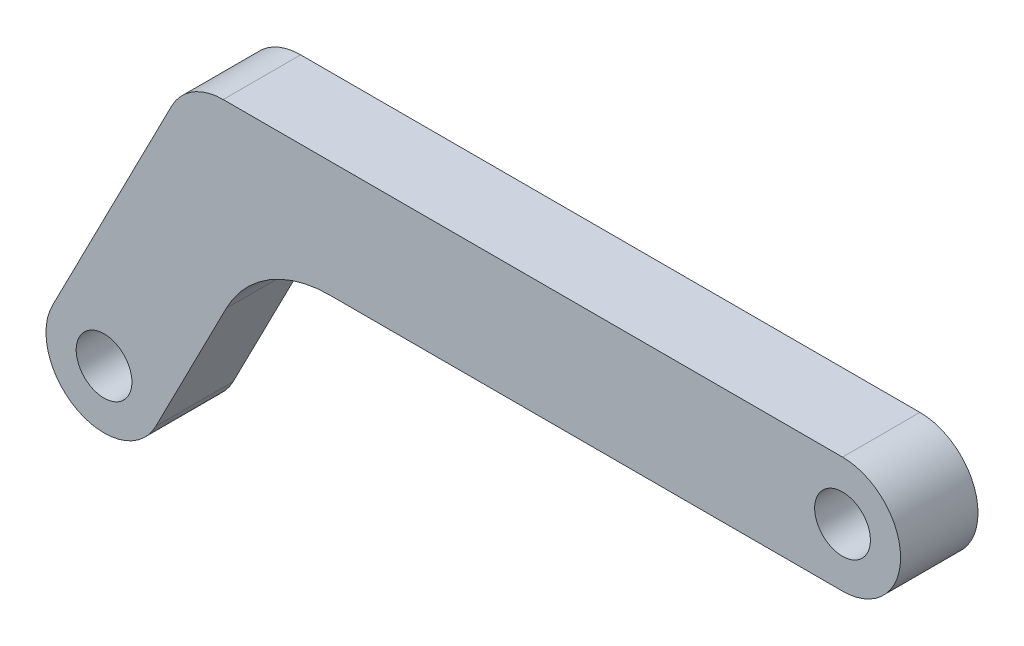
ISO-10303-21;
HEADER;
FILE_DESCRIPTION(('STEP AP214'),'2;1');
FILE_NAME('part.step','',(''),(''),'','','');
FILE_SCHEMA(('AUTOMOTIVE_DESIGN { 1 0 10303 214 1 1 1 1 }'));
ENDSEC;
DATA;
#1=APPLICATION_CONTEXT('core data for automotive mechanical design processes');
#2=APPLICATION_PROTOCOL_DEFINITION('international standard','automotive_design',2000,#1);
#3=PRODUCT_CONTEXT('',#1,'mechanical');
#4=PRODUCT('Part','Part','',(#3));
#5=PRODUCT_RELATED_PRODUCT_CATEGORY('part','',(#4));
#6=PRODUCT_DEFINITION_FORMATION('','',#4);
#7=PRODUCT_DEFINITION_CONTEXT('part definition',#1,'design');
#8=PRODUCT_DEFINITION('design','',#6,#7);
#9=PRODUCT_DEFINITION_SHAPE('','',#8);
#10=(LENGTH_UNIT() NAMED_UNIT(*) SI_UNIT(.MILLI.,.METRE.));
#11=(NAMED_UNIT(*) PLANE_ANGLE_UNIT() SI_UNIT($,.RADIAN.));
#12=(NAMED_UNIT(*) SI_UNIT($,.STERADIAN.) SOLID_ANGLE_UNIT());
#13=UNCERTAINTY_MEASURE_WITH_UNIT(LENGTH_MEASURE(1.E-05),#10,'distance_accuracy_value','');
#14=(GEOMETRIC_REPRESENTATION_CONTEXT(3) GLOBAL_UNCERTAINTY_ASSIGNED_CONTEXT((#13)) GLOBAL_UNIT_ASSIGNED_CONTEXT((#10,
#11,#12)) REPRESENTATION_CONTEXT('',''));
#15=CARTESIAN_POINT('',(0.,0.,0.));
#16=DIRECTION('',(0.,0.,1.));
#17=DIRECTION('',(1.,0.,0.));
#18=AXIS2_PLACEMENT_3D('',#15,#16,#17);
#19=CARTESIAN_POINT('',(-60.5751392899761,-19.05,6.35));
#20=DIRECTION('',(0.,0.,1.));
#21=DIRECTION('',(1.,0.,0.));
#22=AXIS2_PLACEMENT_3D('',#19,#20,#21);
#23=PLANE('',#22);
#24=CARTESIAN_POINT('',(0.,0.,6.35));
#25=DIRECTION('',(0.,0.,1.));
#26=DIRECTION('',(1.,0.,0.));
#27=AXIS2_PLACEMENT_3D('',#24,#25,#26);
#28=CIRCLE('',#27,2.286);
#29=CARTESIAN_POINT('',(2.286,0.,6.35));
#30=VERTEX_POINT('',#29);
#31=EDGE_CURVE('E169',#30,#30,#28,.T.);
#32=ORIENTED_EDGE('',*,*,#31,.F.);
#33=EDGE_LOOP('',(#32));
#34=FACE_BOUND('',#33,.T.);
#35=CARTESIAN_POINT('',(-60.5751392899761,-19.05,6.35));
#36=DIRECTION('',(0.,0.,1.));
#37=DIRECTION('',(1.,0.,0.));
#38=AXIS2_PLACEMENT_3D('',#35,#36,#37);
#39=CIRCLE('',#38,4.76250000000001);
#40=CARTESIAN_POINT('',(-64.8123612087048,-16.8757514720151,6.35));
#41=VERTEX_POINT('',#40);
#42=CARTESIAN_POINT('',(-56.3379173712473,-21.2242485279849,6.35));
#43=VERTEX_POINT('',#42);
#44=EDGE_CURVE('E187',#41,#43,#39,.T.);
#45=ORIENTED_EDGE('',*,*,#44,.T.);
#46=DIRECTION('',(0.456535123986339,0.889705389759317,0.));
#47=VECTOR('',#46,1.);
#48=CARTESIAN_POINT('',(-56.3379173712473,-21.2242485279849,6.35));
#49=LINE('',#48,#47);
#50=CARTESIAN_POINT('',(-50.5471117279536,-9.93900294403013,6.35));
#51=VERTEX_POINT('',#50);
#52=EDGE_CURVE('E119',#43,#51,#49,.T.);
#53=ORIENTED_EDGE('',*,*,#52,.T.);
#54=CARTESIAN_POINT('',(-42.0726678904961,-14.2875,6.35));
#55=DIRECTION('',(0.,0.,-1.));
#56=DIRECTION('',(-1.,0.,0.));
#57=AXIS2_PLACEMENT_3D('',#54,#55,#56);
#58=CIRCLE('',#57,9.525);
#59=CARTESIAN_POINT('',(-42.0726678904961,-4.7625,6.35));
#60=VERTEX_POINT('',#59);
#61=EDGE_CURVE('E209',#51,#60,#58,.T.);
#62=ORIENTED_EDGE('',*,*,#61,.T.);
#63=DIRECTION('',(1.,0.,0.));
#64=VECTOR('',#63,1.);
#65=CARTESIAN_POINT('',(-42.0726678904961,-4.7625,6.35));
#66=LINE('',#65,#64);
#67=CARTESIAN_POINT('',(0.,-4.7625,6.35));
#68=VERTEX_POINT('',#67);
#69=EDGE_CURVE('E223',#60,#68,#66,.T.);
#70=ORIENTED_EDGE('',*,*,#69,.T.);
#71=CARTESIAN_POINT('',(0.,0.,6.35));
#72=DIRECTION('',(0.,0.,1.));
#73=DIRECTION('',(1.,0.,0.));
#74=AXIS2_PLACEMENT_3D('',#71,#72,#73);
#75=CIRCLE('',#74,4.7625);
#76=CARTESIAN_POINT('',(0.,4.7625,6.35));
#77=VERTEX_POINT('',#76);
#78=EDGE_CURVE('E141',#68,#77,#75,.T.);
#79=ORIENTED_EDGE('',*,*,#78,.T.);
#80=DIRECTION('',(-1.,0.,0.));
#81=VECTOR('',#80,1.);
#82=CARTESIAN_POINT('',(-50.8,4.7625,6.35));
#83=LINE('',#82,#81);
#84=CARTESIAN_POINT('',(-50.8,4.7625,6.35));
#85=VERTEX_POINT('',#84);
#86=EDGE_CURVE('E135',#77,#85,#83,.T.);
#87=ORIENTED_EDGE('',*,*,#86,.T.);
#88=CARTESIAN_POINT('',(-50.8,0.,6.35));
#89=DIRECTION('',(0.,0.,1.));
#90=DIRECTION('',(1.,0.,0.));
#91=AXIS2_PLACEMENT_3D('',#88,#89,#90);
#92=CIRCLE('',#91,4.7625);
#93=CARTESIAN_POINT('',(-55.0372219187287,2.17424852798494,6.35));
#94=VERTEX_POINT('',#93);
#95=EDGE_CURVE('E139',#85,#94,#92,.T.);
#96=ORIENTED_EDGE('',*,*,#95,.T.);
#97=DIRECTION('',(-0.456535123986339,-0.889705389759317,0.));
#98=VECTOR('',#97,1.);
#99=CARTESIAN_POINT('',(-64.8123612087048,-16.8757514720151,6.35));
#100=LINE('',#99,#98);
#101=EDGE_CURVE('E66',#94,#41,#100,.T.);
#102=ORIENTED_EDGE('',*,*,#101,.T.);
#103=EDGE_LOOP('',(#45,#53,#62,#70,#79,#87,#96,#102));
#104=FACE_BOUND('',#103,.T.);
#105=CARTESIAN_POINT('',(-60.5751392899761,-19.05,6.35));
#106=DIRECTION('',(0.,0.,1.));
#107=DIRECTION('',(1.,0.,0.));
#108=AXIS2_PLACEMENT_3D('',#105,#106,#107);
#109=CIRCLE('',#108,2.286);
#110=CARTESIAN_POINT('',(-58.289139289976,-19.05,6.35));
#111=VERTEX_POINT('',#110);
#112=EDGE_CURVE('E236',#111,#111,#109,.T.);
#113=ORIENTED_EDGE('',*,*,#112,.F.);
#114=EDGE_LOOP('',(#113));
#115=FACE_BOUND('',#114,.T.);
#116=ADVANCED_FACE('F45',(#34,#104,#115),#23,.T.);
#117=CARTESIAN_POINT('',(-60.5751392899761,-19.05,0.));
#118=DIRECTION('',(0.,0.,1.));
#119=DIRECTION('',(1.,0.,0.));
#120=AXIS2_PLACEMENT_3D('',#117,#118,#119);
#121=PLANE('',#120);
#122=CARTESIAN_POINT('',(-60.5751392899761,-19.05,0.));
#123=DIRECTION('',(0.,0.,1.));
#124=DIRECTION('',(1.,0.,0.));
#125=AXIS2_PLACEMENT_3D('',#122,#123,#124);
#126=CIRCLE('',#125,4.76250000000001);
#127=CARTESIAN_POINT('',(-64.8123612087048,-16.8757514720151,0.));
#128=VERTEX_POINT('',#127);
#129=CARTESIAN_POINT('',(-56.3379173712473,-21.2242485279849,0.));
#130=VERTEX_POINT('',#129);
#131=EDGE_CURVE('E164',#128,#130,#126,.T.);
#132=ORIENTED_EDGE('',*,*,#131,.F.);
#133=DIRECTION('',(-0.456535123986339,-0.889705389759317,0.));
#134=VECTOR('',#133,1.);
#135=CARTESIAN_POINT('',(-64.8123612087048,-16.8757514720151,0.));
#136=LINE('',#135,#134);
#137=CARTESIAN_POINT('',(-55.0372219187287,2.17424852798494,0.));
#138=VERTEX_POINT('',#137);
#139=EDGE_CURVE('E109',#138,#128,#136,.T.);
#140=ORIENTED_EDGE('',*,*,#139,.F.);
#141=CARTESIAN_POINT('',(-50.8,0.,0.));
#142=DIRECTION('',(0.,0.,1.));
#143=DIRECTION('',(1.,0.,0.));
#144=AXIS2_PLACEMENT_3D('',#141,#142,#143);
#145=CIRCLE('',#144,4.7625);
#146=CARTESIAN_POINT('',(-50.8,4.7625,0.));
#147=VERTEX_POINT('',#146);
#148=EDGE_CURVE('E103',#147,#138,#145,.T.);
#149=ORIENTED_EDGE('',*,*,#148,.F.);
#150=DIRECTION('',(-1.,0.,0.));
#151=VECTOR('',#150,1.);
#152=CARTESIAN_POINT('',(-50.8,4.7625,0.));
#153=LINE('',#152,#151);
#154=CARTESIAN_POINT('',(0.,4.7625,0.));
#155=VERTEX_POINT('',#154);
#156=EDGE_CURVE('E150',#155,#147,#153,.T.);
#157=ORIENTED_EDGE('',*,*,#156,.F.);
#158=CARTESIAN_POINT('',(0.,0.,0.));
#159=DIRECTION('',(0.,0.,1.));
#160=DIRECTION('',(1.,0.,0.));
#161=AXIS2_PLACEMENT_3D('',#158,#159,#160);
#162=CIRCLE('',#161,4.7625);
#163=CARTESIAN_POINT('',(0.,-4.7625,0.));
#164=VERTEX_POINT('',#163);
#165=EDGE_CURVE('E178',#164,#155,#162,.T.);
#166=ORIENTED_EDGE('',*,*,#165,.F.);
#167=DIRECTION('',(1.,0.,0.));
#168=VECTOR('',#167,1.);
#169=CARTESIAN_POINT('',(-42.0726678904961,-4.7625,0.));
#170=LINE('',#169,#168);
#171=CARTESIAN_POINT('',(-42.0726678904961,-4.7625,0.));
#172=VERTEX_POINT('',#171);
#173=EDGE_CURVE('E175',#172,#164,#170,.T.);
#174=ORIENTED_EDGE('',*,*,#173,.F.);
#175=CARTESIAN_POINT('',(-42.0726678904961,-14.2875,0.));
#176=DIRECTION('',(0.,0.,-1.));
#177=DIRECTION('',(-1.,0.,0.));
#178=AXIS2_PLACEMENT_3D('',#175,#176,#177);
#179=CIRCLE('',#178,9.525);
#180=CARTESIAN_POINT('',(-50.5471117279536,-9.93900294403013,0.));
#181=VERTEX_POINT('',#180);
#182=EDGE_CURVE('E172',#181,#172,#179,.T.);
#183=ORIENTED_EDGE('',*,*,#182,.F.);
#184=DIRECTION('',(0.456535123986339,0.889705389759317,0.));
#185=VECTOR('',#184,1.);
#186=CARTESIAN_POINT('',(-56.3379173712473,-21.2242485279849,0.));
#187=LINE('',#186,#185);
#188=EDGE_CURVE('E168',#130,#181,#187,.T.);
#189=ORIENTED_EDGE('',*,*,#188,.F.);
#190=EDGE_LOOP('',(#132,#140,#149,#157,#166,#174,#183,#189));
#191=FACE_BOUND('',#190,.T.);
#192=CARTESIAN_POINT('',(0.,0.,0.));
#193=DIRECTION('',(0.,0.,1.));
#194=DIRECTION('',(1.,0.,0.));
#195=AXIS2_PLACEMENT_3D('',#192,#193,#194);
#196=CIRCLE('',#195,2.286);
#197=CARTESIAN_POINT('',(2.286,0.,0.));
#198=VERTEX_POINT('',#197);
#199=EDGE_CURVE('E232',#198,#198,#196,.T.);
#200=ORIENTED_EDGE('',*,*,#199,.T.);
#201=EDGE_LOOP('',(#200));
#202=FACE_BOUND('',#201,.T.);
#203=CARTESIAN_POINT('',(-60.5751392899761,-19.05,0.));
#204=DIRECTION('',(0.,0.,1.));
#205=DIRECTION('',(1.,0.,0.));
#206=AXIS2_PLACEMENT_3D('',#203,#204,#205);
#207=CIRCLE('',#206,2.286);
#208=CARTESIAN_POINT('',(-58.289139289976,-19.05,0.));
#209=VERTEX_POINT('',#208);
#210=EDGE_CURVE('E240',#209,#209,#207,.T.);
#211=ORIENTED_EDGE('',*,*,#210,.T.);
#212=EDGE_LOOP('',(#211));
#213=FACE_BOUND('',#212,.T.);
#214=ADVANCED_FACE('F213',(#191,#202,#213),#121,.F.);
#215=CARTESIAN_POINT('',(-60.5751392899761,-19.05,6.35));
#216=DIRECTION('',(0.,0.,-1.));
#217=DIRECTION('',(-1.,0.,0.));
#218=AXIS2_PLACEMENT_3D('',#215,#216,#217);
#219=CYLINDRICAL_SURFACE('',#218,4.76250000000001);
#220=ORIENTED_EDGE('',*,*,#131,.T.);
#221=DIRECTION('',(0.,0.,-1.));
#222=VECTOR('',#221,1.);
#223=CARTESIAN_POINT('',(-56.3379173712473,-21.2242485279849,6.35));
#224=LINE('',#223,#222);
#225=EDGE_CURVE('E11',#43,#130,#224,.T.);
#226=ORIENTED_EDGE('',*,*,#225,.F.);
#227=ORIENTED_EDGE('',*,*,#44,.F.);
#228=DIRECTION('',(0.,0.,-1.));
#229=VECTOR('',#228,1.);
#230=CARTESIAN_POINT('',(-64.8123612087048,-16.8757514720151,6.35));
#231=LINE('',#230,#229);
#232=EDGE_CURVE('E160',#41,#128,#231,.T.);
#233=ORIENTED_EDGE('',*,*,#232,.T.);
#234=EDGE_LOOP('',(#220,#226,#227,#233));
#235=FACE_BOUND('',#234,.T.);
#236=ADVANCED_FACE('F47',(#235),#219,.T.);
#237=CARTESIAN_POINT('',(-56.3379173712473,-21.2242485279849,6.35));
#238=DIRECTION('',(-0.889705389759317,0.456535123986339,0.));
#239=DIRECTION('',(-0.456535123986339,-0.889705389759317,0.));
#240=AXIS2_PLACEMENT_3D('',#237,#238,#239);
#241=PLANE('',#240);
#242=ORIENTED_EDGE('',*,*,#188,.T.);
#243=DIRECTION('',(0.,0.,-1.));
#244=VECTOR('',#243,1.);
#245=CARTESIAN_POINT('',(-50.5471117279536,-9.93900294403013,6.35));
#246=LINE('',#245,#244);
#247=EDGE_CURVE('E55',#51,#181,#246,.T.);
#248=ORIENTED_EDGE('',*,*,#247,.F.);
#249=ORIENTED_EDGE('',*,*,#52,.F.);
#250=ORIENTED_EDGE('',*,*,#225,.T.);
#251=EDGE_LOOP('',(#242,#248,#249,#250));
#252=FACE_BOUND('',#251,.T.);
#253=ADVANCED_FACE('F274',(#252),#241,.F.);
#254=CARTESIAN_POINT('',(-42.0726678904961,-14.2875,6.35));
#255=DIRECTION('',(0.,0.,-1.));
#256=DIRECTION('',(-1.,0.,0.));
#257=AXIS2_PLACEMENT_3D('',#254,#255,#256);
#258=CYLINDRICAL_SURFACE('',#257,9.525);
#259=ORIENTED_EDGE('',*,*,#182,.T.);
#260=DIRECTION('',(0.,0.,-1.));
#261=VECTOR('',#260,1.);
#262=CARTESIAN_POINT('',(-42.0726678904961,-4.7625,6.35));
#263=LINE('',#262,#261);
#264=EDGE_CURVE('E198',#60,#172,#263,.T.);
#265=ORIENTED_EDGE('',*,*,#264,.F.);
#266=ORIENTED_EDGE('',*,*,#61,.F.);
#267=ORIENTED_EDGE('',*,*,#247,.T.);
#268=EDGE_LOOP('',(#259,#265,#266,#267));
#269=FACE_BOUND('',#268,.T.);
#270=ADVANCED_FACE('F207',(#269),#258,.F.);
#271=CARTESIAN_POINT('',(-42.0726678904961,-4.7625,6.35));
#272=DIRECTION('',(0.,1.,0.));
#273=DIRECTION('',(-1.,0.,0.));
#274=AXIS2_PLACEMENT_3D('',#271,#272,#273);
#275=PLANE('',#274);
#276=ORIENTED_EDGE('',*,*,#173,.T.);
#277=DIRECTION('',(0.,0.,-1.));
#278=VECTOR('',#277,1.);
#279=CARTESIAN_POINT('',(0.,-4.7625,6.35));
#280=LINE('',#279,#278);
#281=EDGE_CURVE('E194',#68,#164,#280,.T.);
#282=ORIENTED_EDGE('',*,*,#281,.F.);
#283=ORIENTED_EDGE('',*,*,#69,.F.);
#284=ORIENTED_EDGE('',*,*,#264,.T.);
#285=EDGE_LOOP('',(#276,#282,#283,#284));
#286=FACE_BOUND('',#285,.T.);
#287=ADVANCED_FACE('F218',(#286),#275,.F.);
#288=CARTESIAN_POINT('',(0.,0.,6.35));
#289=DIRECTION('',(0.,0.,-1.));
#290=DIRECTION('',(-1.,0.,0.));
#291=AXIS2_PLACEMENT_3D('',#288,#289,#290);
#292=CYLINDRICAL_SURFACE('',#291,4.7625);
#293=ORIENTED_EDGE('',*,*,#165,.T.);
#294=DIRECTION('',(0.,0.,-1.));
#295=VECTOR('',#294,1.);
#296=CARTESIAN_POINT('',(0.,4.7625,6.35));
#297=LINE('',#296,#295);
#298=EDGE_CURVE('E152',#77,#155,#297,.T.);
#299=ORIENTED_EDGE('',*,*,#298,.F.);
#300=ORIENTED_EDGE('',*,*,#78,.F.);
#301=ORIENTED_EDGE('',*,*,#281,.T.);
#302=EDGE_LOOP('',(#293,#299,#300,#301));
#303=FACE_BOUND('',#302,.T.);
#304=ADVANCED_FACE('F221',(#303),#292,.T.);
#305=CARTESIAN_POINT('',(-50.8,4.7625,6.35));
#306=DIRECTION('',(0.,-1.,0.));
#307=DIRECTION('',(1.,0.,0.));
#308=AXIS2_PLACEMENT_3D('',#305,#306,#307);
#309=PLANE('',#308);
#310=ORIENTED_EDGE('',*,*,#156,.T.);
#311=DIRECTION('',(0.,0.,-1.));
#312=VECTOR('',#311,1.);
#313=CARTESIAN_POINT('',(-50.8,4.7625,6.35));
#314=LINE('',#313,#312);
#315=EDGE_CURVE('E147',#85,#147,#314,.T.);
#316=ORIENTED_EDGE('',*,*,#315,.F.);
#317=ORIENTED_EDGE('',*,*,#86,.F.);
#318=ORIENTED_EDGE('',*,*,#298,.T.);
#319=EDGE_LOOP('',(#310,#316,#317,#318));
#320=FACE_BOUND('',#319,.T.);
#321=ADVANCED_FACE('F148',(#320),#309,.F.);
#322=CARTESIAN_POINT('',(-50.8,0.,6.35));
#323=DIRECTION('',(0.,0.,-1.));
#324=DIRECTION('',(-1.,0.,0.));
#325=AXIS2_PLACEMENT_3D('',#322,#323,#324);
#326=CYLINDRICAL_SURFACE('',#325,4.7625);
#327=ORIENTED_EDGE('',*,*,#148,.T.);
#328=DIRECTION('',(0.,0.,-1.));
#329=VECTOR('',#328,1.);
#330=CARTESIAN_POINT('',(-55.0372219187287,2.17424852798494,6.35));
#331=LINE('',#330,#329);
#332=EDGE_CURVE('E153',#94,#138,#331,.T.);
#333=ORIENTED_EDGE('',*,*,#332,.F.);
#334=ORIENTED_EDGE('',*,*,#95,.F.);
#335=ORIENTED_EDGE('',*,*,#315,.T.);
#336=EDGE_LOOP('',(#327,#333,#334,#335));
#337=FACE_BOUND('',#336,.T.);
#338=ADVANCED_FACE('F155',(#337),#326,.T.);
#339=CARTESIAN_POINT('',(-64.8123612087048,-16.8757514720151,6.35));
#340=DIRECTION('',(0.889705389759317,-0.456535123986339,0.));
#341=DIRECTION('',(0.456535123986339,0.889705389759317,0.));
#342=AXIS2_PLACEMENT_3D('',#339,#340,#341);
#343=PLANE('',#342);
#344=ORIENTED_EDGE('',*,*,#139,.T.);
#345=ORIENTED_EDGE('',*,*,#232,.F.);
#346=ORIENTED_EDGE('',*,*,#101,.F.);
#347=ORIENTED_EDGE('',*,*,#332,.T.);
#348=EDGE_LOOP('',(#344,#345,#346,#347));
#349=FACE_BOUND('',#348,.T.);
#350=ADVANCED_FACE('F262',(#349),#343,.F.);
#351=CARTESIAN_POINT('',(0.,0.,6.35));
#352=DIRECTION('',(0.,0.,-1.));
#353=DIRECTION('',(-1.,0.,0.));
#354=AXIS2_PLACEMENT_3D('',#351,#352,#353);
#355=CYLINDRICAL_SURFACE('',#354,2.286);
#356=ORIENTED_EDGE('',*,*,#31,.T.);
#357=EDGE_LOOP('',(#356));
#358=FACE_BOUND('',#357,.T.);
#359=ORIENTED_EDGE('',*,*,#199,.F.);
#360=EDGE_LOOP('',(#359));
#361=FACE_BOUND('',#360,.T.);
#362=ADVANCED_FACE('F259',(#358,#361),#355,.F.);
#363=CARTESIAN_POINT('',(-60.5751392899761,-19.05,6.35));
#364=DIRECTION('',(0.,0.,-1.));
#365=DIRECTION('',(-1.,0.,0.));
#366=AXIS2_PLACEMENT_3D('',#363,#364,#365);
#367=CYLINDRICAL_SURFACE('',#366,2.286);
#368=ORIENTED_EDGE('',*,*,#112,.T.);
#369=EDGE_LOOP('',(#368));
#370=FACE_BOUND('',#369,.T.);
#371=ORIENTED_EDGE('',*,*,#210,.F.);
#372=EDGE_LOOP('',(#371));
#373=FACE_BOUND('',#372,.T.);
#374=ADVANCED_FACE('F247',(#370,#373),#367,.F.);
#375=CLOSED_SHELL('',(#116,#214,#236,#253,#270,#287,#304,#321,#338,#350,#362,#374));
#376=MANIFOLD_SOLID_BREP('B2',#375);
#377=ADVANCED_BREP_SHAPE_REPRESENTATION('',(#18,#376),#14);
#378=SHAPE_DEFINITION_REPRESENTATION(#9,#377);
ENDSEC;
END-ISO-10303-21;
